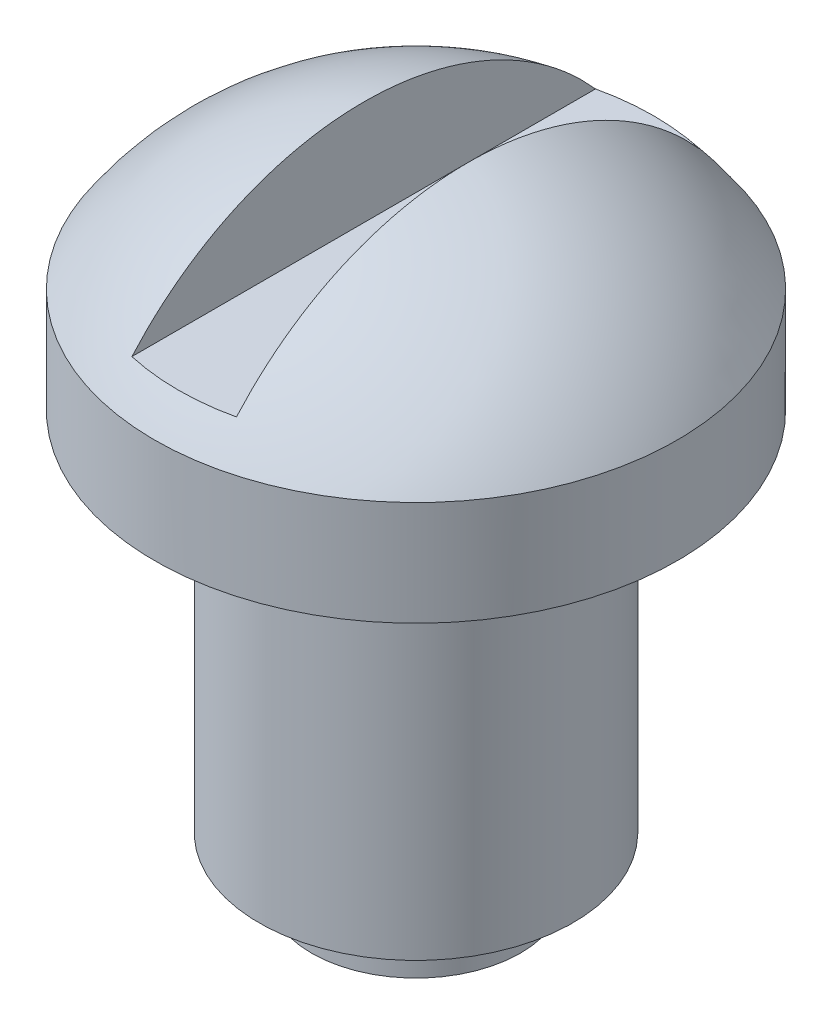
ISO-10303-21;
HEADER;
FILE_DESCRIPTION(('STEP AP214'),'2;1');
FILE_NAME('part.step','',(''),(''),'','','');
FILE_SCHEMA(('AUTOMOTIVE_DESIGN { 1 0 10303 214 1 1 1 1 }'));
ENDSEC;
DATA;
#1=APPLICATION_CONTEXT('core data for automotive mechanical design processes');
#2=APPLICATION_PROTOCOL_DEFINITION('international standard','automotive_design',2000,#1);
#3=PRODUCT_CONTEXT('',#1,'mechanical');
#4=PRODUCT('Part','Part','',(#3));
#5=PRODUCT_RELATED_PRODUCT_CATEGORY('part','',(#4));
#6=PRODUCT_DEFINITION_FORMATION('','',#4);
#7=PRODUCT_DEFINITION_CONTEXT('part definition',#1,'design');
#8=PRODUCT_DEFINITION('design','',#6,#7);
#9=PRODUCT_DEFINITION_SHAPE('','',#8);
#10=(LENGTH_UNIT() NAMED_UNIT(*) SI_UNIT(.MILLI.,.METRE.));
#11=(NAMED_UNIT(*) PLANE_ANGLE_UNIT() SI_UNIT($,.RADIAN.));
#12=(NAMED_UNIT(*) SI_UNIT($,.STERADIAN.) SOLID_ANGLE_UNIT());
#13=UNCERTAINTY_MEASURE_WITH_UNIT(LENGTH_MEASURE(1.E-05),#10,'distance_accuracy_value','');
#14=(GEOMETRIC_REPRESENTATION_CONTEXT(3) GLOBAL_UNCERTAINTY_ASSIGNED_CONTEXT((#13)) GLOBAL_UNIT_ASSIGNED_CONTEXT((#10,
#11,#12)) REPRESENTATION_CONTEXT('',''));
#15=CARTESIAN_POINT('',(0.,0.,0.));
#16=DIRECTION('',(0.,0.,1.));
#17=DIRECTION('',(1.,0.,0.));
#18=AXIS2_PLACEMENT_3D('',#15,#16,#17);
#19=CARTESIAN_POINT('',(0.,0.,0.));
#20=DIRECTION('',(0.,-1.,0.));
#21=DIRECTION('',(0.,0.,-1.));
#22=AXIS2_PLACEMENT_3D('',#19,#20,#21);
#23=PLANE('',#22);
#24=CARTESIAN_POINT('',(0.,0.,0.));
#25=DIRECTION('',(0.,-1.,0.));
#26=DIRECTION('',(0.,0.,-1.));
#27=AXIS2_PLACEMENT_3D('',#24,#25,#26);
#28=CIRCLE('',#27,2.);
#29=CARTESIAN_POINT('',(0.,0.,-2.));
#30=VERTEX_POINT('',#29);
#31=EDGE_CURVE('E67',#30,#30,#28,.T.);
#32=ORIENTED_EDGE('',*,*,#31,.T.);
#33=EDGE_LOOP('',(#32));
#34=FACE_BOUND('',#33,.T.);
#35=ADVANCED_FACE('F39',(#34),#23,.T.);
#36=CARTESIAN_POINT('',(0.,8.,0.));
#37=DIRECTION('',(0.,-1.,0.));
#38=DIRECTION('',(0.,0.,-1.));
#39=AXIS2_PLACEMENT_3D('',#36,#37,#38);
#40=CYLINDRICAL_SURFACE('',#39,2.);
#41=CARTESIAN_POINT('',(0.,1.,0.));
#42=DIRECTION('',(0.,-1.,0.));
#43=DIRECTION('',(0.,0.,-1.));
#44=AXIS2_PLACEMENT_3D('',#41,#42,#43);
#45=CIRCLE('',#44,2.);
#46=CARTESIAN_POINT('',(0.,1.,-2.));
#47=VERTEX_POINT('',#46);
#48=EDGE_CURVE('E80',#47,#47,#45,.T.);
#49=ORIENTED_EDGE('',*,*,#48,.T.);
#50=EDGE_LOOP('',(#49));
#51=FACE_BOUND('',#50,.T.);
#52=ORIENTED_EDGE('',*,*,#31,.F.);
#53=EDGE_LOOP('',(#52));
#54=FACE_BOUND('',#53,.T.);
#55=ADVANCED_FACE('F107',(#51,#54),#40,.T.);
#56=CARTESIAN_POINT('',(0.,1.,0.));
#57=DIRECTION('',(0.,-1.,0.));
#58=DIRECTION('',(0.,0.,-1.));
#59=AXIS2_PLACEMENT_3D('',#56,#57,#58);
#60=PLANE('',#59);
#61=CARTESIAN_POINT('',(0.,1.,0.));
#62=DIRECTION('',(0.,-1.,0.));
#63=DIRECTION('',(0.,0.,-1.));
#64=AXIS2_PLACEMENT_3D('',#61,#62,#63);
#65=CIRCLE('',#64,3.);
#66=CARTESIAN_POINT('',(0.,1.,-3.));
#67=VERTEX_POINT('',#66);
#68=EDGE_CURVE('E83',#67,#67,#65,.T.);
#69=ORIENTED_EDGE('',*,*,#68,.T.);
#70=EDGE_LOOP('',(#69));
#71=FACE_BOUND('',#70,.T.);
#72=ORIENTED_EDGE('',*,*,#48,.F.);
#73=EDGE_LOOP('',(#72));
#74=FACE_BOUND('',#73,.T.);
#75=ADVANCED_FACE('F112',(#71,#74),#60,.T.);
#76=CARTESIAN_POINT('',(0.,8.,0.));
#77=DIRECTION('',(0.,-1.,0.));
#78=DIRECTION('',(0.,0.,-1.));
#79=AXIS2_PLACEMENT_3D('',#76,#77,#78);
#80=CYLINDRICAL_SURFACE('',#79,3.);
#81=CARTESIAN_POINT('',(0.,8.,0.));
#82=DIRECTION('',(0.,-1.,0.));
#83=DIRECTION('',(0.,0.,-1.));
#84=AXIS2_PLACEMENT_3D('',#81,#82,#83);
#85=CIRCLE('',#84,3.);
#86=CARTESIAN_POINT('',(0.,8.,-3.));
#87=VERTEX_POINT('',#86);
#88=EDGE_CURVE('E86',#87,#87,#85,.T.);
#89=ORIENTED_EDGE('',*,*,#88,.T.);
#90=EDGE_LOOP('',(#89));
#91=FACE_BOUND('',#90,.T.);
#92=ORIENTED_EDGE('',*,*,#68,.F.);
#93=EDGE_LOOP('',(#92));
#94=FACE_BOUND('',#93,.T.);
#95=ADVANCED_FACE('F119',(#91,#94),#80,.T.);
#96=CARTESIAN_POINT('',(0.,8.,0.));
#97=DIRECTION('',(0.,-1.,0.));
#98=DIRECTION('',(0.,0.,-1.));
#99=AXIS2_PLACEMENT_3D('',#96,#97,#98);
#100=PLANE('',#99);
#101=CARTESIAN_POINT('',(0.,8.,0.));
#102=DIRECTION('',(0.,-1.,0.));
#103=DIRECTION('',(0.,0.,-1.));
#104=AXIS2_PLACEMENT_3D('',#101,#102,#103);
#105=CIRCLE('',#104,5.);
#106=CARTESIAN_POINT('',(0.,8.,-5.));
#107=VERTEX_POINT('',#106);
#108=EDGE_CURVE('E89',#107,#107,#105,.T.);
#109=ORIENTED_EDGE('',*,*,#108,.T.);
#110=EDGE_LOOP('',(#109));
#111=FACE_BOUND('',#110,.T.);
#112=ORIENTED_EDGE('',*,*,#88,.F.);
#113=EDGE_LOOP('',(#112));
#114=FACE_BOUND('',#113,.T.);
#115=ADVANCED_FACE('F125',(#111,#114),#100,.T.);
#116=CARTESIAN_POINT('',(0.,8.,0.));
#117=DIRECTION('',(0.,-1.,0.));
#118=DIRECTION('',(0.,0.,-1.));
#119=AXIS2_PLACEMENT_3D('',#116,#117,#118);
#120=CYLINDRICAL_SURFACE('',#119,5.);
#121=CARTESIAN_POINT('',(0.,10.,0.));
#122=DIRECTION('',(0.,-1.,0.));
#123=DIRECTION('',(0.,0.,-1.));
#124=AXIS2_PLACEMENT_3D('',#121,#122,#123);
#125=CIRCLE('',#124,5.);
#126=CARTESIAN_POINT('',(0.,10.,-5.));
#127=VERTEX_POINT('',#126);
#128=EDGE_CURVE('E92',#127,#127,#125,.T.);
#129=ORIENTED_EDGE('',*,*,#128,.T.);
#130=EDGE_LOOP('',(#129));
#131=FACE_BOUND('',#130,.T.);
#132=ORIENTED_EDGE('',*,*,#108,.F.);
#133=EDGE_LOOP('',(#132));
#134=FACE_BOUND('',#133,.T.);
#135=ADVANCED_FACE('F104',(#131,#134),#120,.T.);
#136=CARTESIAN_POINT('',(0.,6.6833752096446,0.));
#137=DIRECTION('',(0.,-1.,0.));
#138=DIRECTION('',(1.,0.,0.));
#139=AXIS2_PLACEMENT_3D('',#136,#137,#138);
#140=SPHERICAL_SURFACE('',#139,6.);
#141=CARTESIAN_POINT('',(1.,6.6833752096446,0.));
#142=DIRECTION('',(1.,0.,0.));
#143=DIRECTION('',(0.,0.,-1.));
#144=AXIS2_PLACEMENT_3D('',#141,#142,#143);
#145=CIRCLE('',#144,5.91607978309962);
#146=CARTESIAN_POINT('',(1.,10.5994549927442,4.4344468800966));
#147=VERTEX_POINT('',#146);
#148=CARTESIAN_POINT('',(1.,10.5994549927442,-4.4344468800966));
#149=VERTEX_POINT('',#148);
#150=EDGE_CURVE('E11',#147,#149,#145,.F.);
#151=ORIENTED_EDGE('',*,*,#150,.F.);
#152=CARTESIAN_POINT('',(0.,10.5994549927442,0.));
#153=DIRECTION('',(0.,1.,0.));
#154=DIRECTION('',(0.,0.,1.));
#155=AXIS2_PLACEMENT_3D('',#152,#153,#154);
#156=CIRCLE('',#155,4.54580236398355);
#157=CARTESIAN_POINT('',(-1.,10.5994549927442,4.4344468800966));
#158=VERTEX_POINT('',#157);
#159=EDGE_CURVE('E66',#147,#158,#156,.F.);
#160=ORIENTED_EDGE('',*,*,#159,.T.);
#161=CARTESIAN_POINT('',(-1.,6.6833752096446,0.));
#162=DIRECTION('',(1.,0.,0.));
#163=DIRECTION('',(0.,0.,-1.));
#164=AXIS2_PLACEMENT_3D('',#161,#162,#163);
#165=CIRCLE('',#164,5.91607978309962);
#166=CARTESIAN_POINT('',(-1.,10.5994549927442,-4.4344468800966));
#167=VERTEX_POINT('',#166);
#168=EDGE_CURVE('E64',#158,#167,#165,.F.);
#169=ORIENTED_EDGE('',*,*,#168,.T.);
#170=EDGE_CURVE('E46',#167,#149,#156,.F.);
#171=ORIENTED_EDGE('',*,*,#170,.T.);
#172=EDGE_LOOP('',(#151,#160,#169,#171));
#173=FACE_BOUND('',#172,.T.);
#174=ORIENTED_EDGE('',*,*,#128,.F.);
#175=EDGE_LOOP('',(#174));
#176=FACE_BOUND('',#175,.T.);
#177=ADVANCED_FACE('F75',(#173,#176),#140,.T.);
#178=CARTESIAN_POINT('',(1.,0.,-5.));
#179=DIRECTION('',(1.,0.,0.));
#180=DIRECTION('',(0.,0.,-1.));
#181=AXIS2_PLACEMENT_3D('',#178,#179,#180);
#182=PLANE('',#181);
#183=DIRECTION('',(0.,0.,1.));
#184=VECTOR('',#183,1.);
#185=CARTESIAN_POINT('',(1.,10.5994549927442,-5.));
#186=LINE('',#185,#184);
#187=EDGE_CURVE('E73',#149,#147,#186,.T.);
#188=ORIENTED_EDGE('',*,*,#187,.T.);
#189=ORIENTED_EDGE('',*,*,#150,.T.);
#190=EDGE_LOOP('',(#188,#189));
#191=FACE_BOUND('',#190,.T.);
#192=ADVANCED_FACE('F96',(#191),#182,.F.);
#193=CARTESIAN_POINT('',(0.,10.5994549927442,-5.));
#194=DIRECTION('',(0.,1.,0.));
#195=DIRECTION('',(0.,0.,1.));
#196=AXIS2_PLACEMENT_3D('',#193,#194,#195);
#197=PLANE('',#196);
#198=DIRECTION('',(0.,0.,1.));
#199=VECTOR('',#198,1.);
#200=CARTESIAN_POINT('',(-1.,10.5994549927442,-5.));
#201=LINE('',#200,#199);
#202=EDGE_CURVE('E52',#167,#158,#201,.T.);
#203=ORIENTED_EDGE('',*,*,#202,.T.);
#204=ORIENTED_EDGE('',*,*,#159,.F.);
#205=ORIENTED_EDGE('',*,*,#187,.F.);
#206=ORIENTED_EDGE('',*,*,#170,.F.);
#207=EDGE_LOOP('',(#203,#204,#205,#206));
#208=FACE_BOUND('',#207,.T.);
#209=ADVANCED_FACE('F70',(#208),#197,.T.);
#210=CARTESIAN_POINT('',(-1.,0.,-5.));
#211=DIRECTION('',(1.,0.,0.));
#212=DIRECTION('',(0.,0.,-1.));
#213=AXIS2_PLACEMENT_3D('',#210,#211,#212);
#214=PLANE('',#213);
#215=ORIENTED_EDGE('',*,*,#202,.F.);
#216=ORIENTED_EDGE('',*,*,#168,.F.);
#217=EDGE_LOOP('',(#215,#216));
#218=FACE_BOUND('',#217,.T.);
#219=ADVANCED_FACE('F65',(#218),#214,.T.);
#220=CLOSED_SHELL('',(#35,#55,#75,#95,#115,#135,#177,#192,#209,#219));
#221=MANIFOLD_SOLID_BREP('B2',#220);
#222=ADVANCED_BREP_SHAPE_REPRESENTATION('',(#18,#221),#14);
#223=SHAPE_DEFINITION_REPRESENTATION(#9,#222);
ENDSEC;
END-ISO-10303-21;
